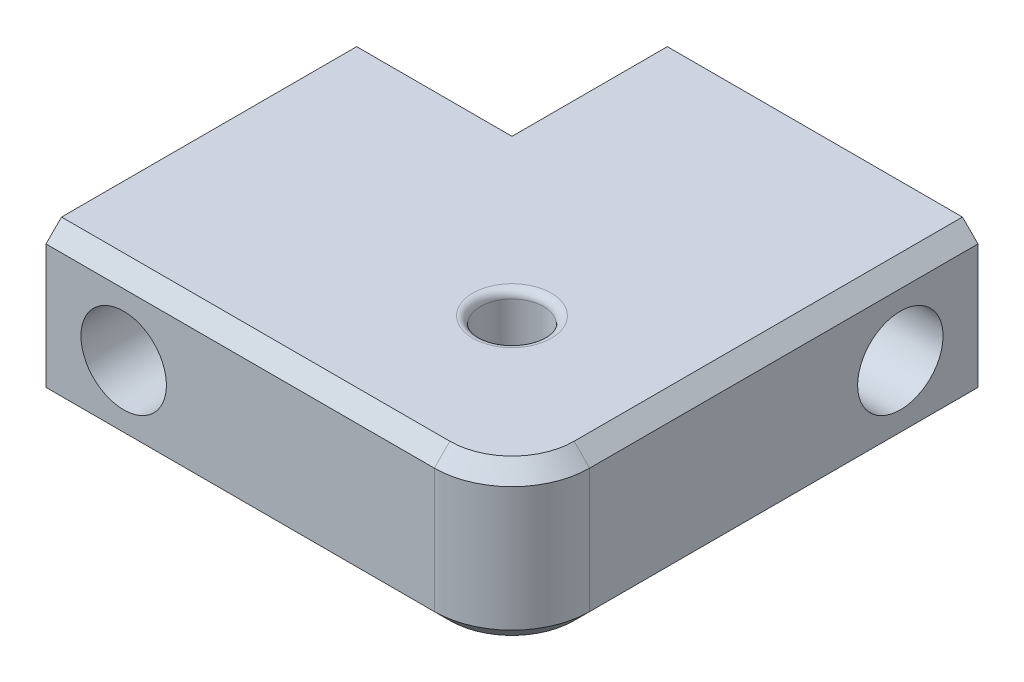
ISO-10303-21;
HEADER;
FILE_DESCRIPTION(('STEP AP214'),'2;1');
FILE_NAME('part.step','',(''),(''),'','','');
FILE_SCHEMA(('AUTOMOTIVE_DESIGN { 1 0 10303 214 1 1 1 1 }'));
ENDSEC;
DATA;
#1=APPLICATION_CONTEXT('core data for automotive mechanical design processes');
#2=APPLICATION_PROTOCOL_DEFINITION('international standard','automotive_design',2000,#1);
#3=PRODUCT_CONTEXT('',#1,'mechanical');
#4=PRODUCT('Part','Part','',(#3));
#5=PRODUCT_RELATED_PRODUCT_CATEGORY('part','',(#4));
#6=PRODUCT_DEFINITION_FORMATION('','',#4);
#7=PRODUCT_DEFINITION_CONTEXT('part definition',#1,'design');
#8=PRODUCT_DEFINITION('design','',#6,#7);
#9=PRODUCT_DEFINITION_SHAPE('','',#8);
#10=(LENGTH_UNIT() NAMED_UNIT(*) SI_UNIT(.MILLI.,.METRE.));
#11=(NAMED_UNIT(*) PLANE_ANGLE_UNIT() SI_UNIT($,.RADIAN.));
#12=(NAMED_UNIT(*) SI_UNIT($,.STERADIAN.) SOLID_ANGLE_UNIT());
#13=UNCERTAINTY_MEASURE_WITH_UNIT(LENGTH_MEASURE(1.E-05),#10,'distance_accuracy_value','');
#14=(GEOMETRIC_REPRESENTATION_CONTEXT(3) GLOBAL_UNCERTAINTY_ASSIGNED_CONTEXT((#13)) GLOBAL_UNIT_ASSIGNED_CONTEXT((#10,
#11,#12)) REPRESENTATION_CONTEXT('',''));
#15=CARTESIAN_POINT('',(0.,0.,0.));
#16=DIRECTION('',(0.,0.,1.));
#17=DIRECTION('',(1.,0.,0.));
#18=AXIS2_PLACEMENT_3D('',#15,#16,#17);
#19=CARTESIAN_POINT('',(10.,20.,10.));
#20=DIRECTION('',(0.,1.,0.));
#21=DIRECTION('',(0.,0.,1.));
#22=AXIS2_PLACEMENT_3D('',#19,#20,#21);
#23=PLANE('',#22);
#24=CARTESIAN_POINT('',(0.,20.,0.));
#25=DIRECTION('',(0.,1.,0.));
#26=DIRECTION('',(0.,0.,1.));
#27=AXIS2_PLACEMENT_3D('',#24,#25,#26);
#28=CIRCLE('',#27,5.05);
#29=CARTESIAN_POINT('',(0.,20.,5.05));
#30=VERTEX_POINT('',#29);
#31=EDGE_CURVE('E155',#30,#30,#28,.F.);
#32=ORIENTED_EDGE('',*,*,#31,.T.);
#33=EDGE_LOOP('',(#32));
#34=FACE_BOUND('',#33,.T.);
#35=CARTESIAN_POINT('',(10.,20.,10.));
#36=DIRECTION('',(0.,1.,0.));
#37=DIRECTION('',(0.,0.,1.));
#38=AXIS2_PLACEMENT_3D('',#35,#36,#37);
#39=CIRCLE('',#38,8.00000000000001);
#40=CARTESIAN_POINT('',(10.,20.,18.));
#41=VERTEX_POINT('',#40);
#42=CARTESIAN_POINT('',(18.,20.,10.));
#43=VERTEX_POINT('',#42);
#44=EDGE_CURVE('E51',#41,#43,#39,.T.);
#45=ORIENTED_EDGE('',*,*,#44,.T.);
#46=DIRECTION('',(0.,0.,-1.));
#47=VECTOR('',#46,1.);
#48=CARTESIAN_POINT('',(18.,20.,-40.));
#49=LINE('',#48,#47);
#50=CARTESIAN_POINT('',(18.,20.,-40.));
#51=VERTEX_POINT('',#50);
#52=EDGE_CURVE('E11',#43,#51,#49,.T.);
#53=ORIENTED_EDGE('',*,*,#52,.T.);
#54=DIRECTION('',(-1.,0.,0.));
#55=VECTOR('',#54,1.);
#56=CARTESIAN_POINT('',(-20.,20.,-40.));
#57=LINE('',#56,#55);
#58=CARTESIAN_POINT('',(-20.,20.,-40.));
#59=VERTEX_POINT('',#58);
#60=EDGE_CURVE('E136',#51,#59,#57,.T.);
#61=ORIENTED_EDGE('',*,*,#60,.T.);
#62=DIRECTION('',(0.,0.,1.));
#63=VECTOR('',#62,1.);
#64=CARTESIAN_POINT('',(-20.,20.,-20.));
#65=LINE('',#64,#63);
#66=CARTESIAN_POINT('',(-20.,20.,-20.));
#67=VERTEX_POINT('',#66);
#68=EDGE_CURVE('E137',#59,#67,#65,.T.);
#69=ORIENTED_EDGE('',*,*,#68,.T.);
#70=DIRECTION('',(-1.,0.,0.));
#71=VECTOR('',#70,1.);
#72=CARTESIAN_POINT('',(-20.,20.,-20.));
#73=LINE('',#72,#71);
#74=CARTESIAN_POINT('',(-40.,20.,-20.));
#75=VERTEX_POINT('',#74);
#76=EDGE_CURVE('E127',#67,#75,#73,.T.);
#77=ORIENTED_EDGE('',*,*,#76,.T.);
#78=DIRECTION('',(0.,0.,1.));
#79=VECTOR('',#78,1.);
#80=CARTESIAN_POINT('',(-40.,20.,20.));
#81=LINE('',#80,#79);
#82=CARTESIAN_POINT('',(-40.,20.,18.));
#83=VERTEX_POINT('',#82);
#84=EDGE_CURVE('E134',#75,#83,#81,.T.);
#85=ORIENTED_EDGE('',*,*,#84,.T.);
#86=DIRECTION('',(1.,0.,0.));
#87=VECTOR('',#86,1.);
#88=CARTESIAN_POINT('',(10.,20.,18.));
#89=LINE('',#88,#87);
#90=EDGE_CURVE('E65',#83,#41,#89,.T.);
#91=ORIENTED_EDGE('',*,*,#90,.T.);
#92=EDGE_LOOP('',(#45,#53,#61,#69,#77,#85,#91));
#93=FACE_BOUND('',#92,.T.);
#94=ADVANCED_FACE('F41',(#34,#93),#23,.T.);
#95=CARTESIAN_POINT('',(10.,0.,10.));
#96=DIRECTION('',(0.,1.,0.));
#97=DIRECTION('',(0.,0.,1.));
#98=AXIS2_PLACEMENT_3D('',#95,#96,#97);
#99=PLANE('',#98);
#100=DIRECTION('',(-1.,0.,0.));
#101=VECTOR('',#100,1.);
#102=CARTESIAN_POINT('',(-20.,0.,-40.));
#103=LINE('',#102,#101);
#104=CARTESIAN_POINT('',(18.,0.,-40.));
#105=VERTEX_POINT('',#104);
#106=CARTESIAN_POINT('',(-20.,0.,-40.));
#107=VERTEX_POINT('',#106);
#108=EDGE_CURVE('E144',#105,#107,#103,.T.);
#109=ORIENTED_EDGE('',*,*,#108,.F.);
#110=DIRECTION('',(0.,0.,1.));
#111=VECTOR('',#110,1.);
#112=CARTESIAN_POINT('',(18.,0.,10.));
#113=LINE('',#112,#111);
#114=CARTESIAN_POINT('',(18.,0.,10.));
#115=VERTEX_POINT('',#114);
#116=EDGE_CURVE('E173',#105,#115,#113,.T.);
#117=ORIENTED_EDGE('',*,*,#116,.T.);
#118=CARTESIAN_POINT('',(10.,0.,10.));
#119=DIRECTION('',(0.,1.,0.));
#120=DIRECTION('',(0.,0.,1.));
#121=AXIS2_PLACEMENT_3D('',#118,#119,#120);
#122=CIRCLE('',#121,7.99999999999999);
#123=CARTESIAN_POINT('',(10.,0.,18.));
#124=VERTEX_POINT('',#123);
#125=EDGE_CURVE('E171',#115,#124,#122,.F.);
#126=ORIENTED_EDGE('',*,*,#125,.T.);
#127=DIRECTION('',(-1.,0.,0.));
#128=VECTOR('',#127,1.);
#129=CARTESIAN_POINT('',(10.,0.,18.));
#130=LINE('',#129,#128);
#131=CARTESIAN_POINT('',(-40.,0.,18.));
#132=VERTEX_POINT('',#131);
#133=EDGE_CURVE('E169',#124,#132,#130,.T.);
#134=ORIENTED_EDGE('',*,*,#133,.T.);
#135=DIRECTION('',(0.,0.,1.));
#136=VECTOR('',#135,1.);
#137=CARTESIAN_POINT('',(-40.,0.,20.));
#138=LINE('',#137,#136);
#139=CARTESIAN_POINT('',(-40.,0.,-20.));
#140=VERTEX_POINT('',#139);
#141=EDGE_CURVE('E232',#140,#132,#138,.T.);
#142=ORIENTED_EDGE('',*,*,#141,.F.);
#143=DIRECTION('',(-1.,0.,0.));
#144=VECTOR('',#143,1.);
#145=CARTESIAN_POINT('',(-20.,0.,-20.));
#146=LINE('',#145,#144);
#147=CARTESIAN_POINT('',(-20.,0.,-20.));
#148=VERTEX_POINT('',#147);
#149=EDGE_CURVE('E231',#148,#140,#146,.T.);
#150=ORIENTED_EDGE('',*,*,#149,.F.);
#151=DIRECTION('',(0.,0.,1.));
#152=VECTOR('',#151,1.);
#153=CARTESIAN_POINT('',(-20.,0.,-20.));
#154=LINE('',#153,#152);
#155=EDGE_CURVE('E149',#107,#148,#154,.T.);
#156=ORIENTED_EDGE('',*,*,#155,.F.);
#157=EDGE_LOOP('',(#109,#117,#126,#134,#142,#150,#156));
#158=FACE_BOUND('',#157,.T.);
#159=CARTESIAN_POINT('',(0.,0.,0.));
#160=DIRECTION('',(0.,1.,0.));
#161=DIRECTION('',(0.,0.,1.));
#162=AXIS2_PLACEMENT_3D('',#159,#160,#161);
#163=CIRCLE('',#162,4.05);
#164=CARTESIAN_POINT('',(0.,0.,4.05));
#165=VERTEX_POINT('',#164);
#166=EDGE_CURVE('E198',#165,#165,#163,.T.);
#167=ORIENTED_EDGE('',*,*,#166,.T.);
#168=EDGE_LOOP('',(#167));
#169=FACE_BOUND('',#168,.T.);
#170=ADVANCED_FACE('F287',(#158,#169),#99,.F.);
#171=CARTESIAN_POINT('',(-20.,20.,-20.));
#172=DIRECTION('',(1.,0.,0.));
#173=DIRECTION('',(0.,0.,-1.));
#174=AXIS2_PLACEMENT_3D('',#171,#172,#173);
#175=PLANE('',#174);
#176=CARTESIAN_POINT('',(-20.,10.,-30.));
#177=DIRECTION('',(-1.,0.,0.));
#178=DIRECTION('',(0.,0.,1.));
#179=AXIS2_PLACEMENT_3D('',#176,#177,#178);
#180=CIRCLE('',#179,2.65);
#181=CARTESIAN_POINT('',(-20.,10.,-27.35));
#182=VERTEX_POINT('',#181);
#183=EDGE_CURVE('E199',#182,#182,#180,.T.);
#184=ORIENTED_EDGE('',*,*,#183,.F.);
#185=EDGE_LOOP('',(#184));
#186=FACE_BOUND('',#185,.T.);
#187=ORIENTED_EDGE('',*,*,#155,.T.);
#188=DIRECTION('',(0.,-1.,0.));
#189=VECTOR('',#188,1.);
#190=CARTESIAN_POINT('',(-20.,20.,-20.));
#191=LINE('',#190,#189);
#192=EDGE_CURVE('E128',#67,#148,#191,.T.);
#193=ORIENTED_EDGE('',*,*,#192,.F.);
#194=ORIENTED_EDGE('',*,*,#68,.F.);
#195=DIRECTION('',(0.,-1.,0.));
#196=VECTOR('',#195,1.);
#197=CARTESIAN_POINT('',(-20.,20.,-40.));
#198=LINE('',#197,#196);
#199=EDGE_CURVE('E233',#59,#107,#198,.T.);
#200=ORIENTED_EDGE('',*,*,#199,.T.);
#201=EDGE_LOOP('',(#187,#193,#194,#200));
#202=FACE_BOUND('',#201,.T.);
#203=ADVANCED_FACE('F147',(#186,#202),#175,.F.);
#204=CARTESIAN_POINT('',(-20.,20.,-20.));
#205=DIRECTION('',(0.,0.,1.));
#206=DIRECTION('',(1.,0.,0.));
#207=AXIS2_PLACEMENT_3D('',#204,#205,#206);
#208=PLANE('',#207);
#209=CARTESIAN_POINT('',(-30.,10.,-20.));
#210=DIRECTION('',(0.,0.,-1.));
#211=DIRECTION('',(-1.,0.,0.));
#212=AXIS2_PLACEMENT_3D('',#209,#210,#211);
#213=CIRCLE('',#212,2.65);
#214=CARTESIAN_POINT('',(-32.65,10.,-20.));
#215=VERTEX_POINT('',#214);
#216=EDGE_CURVE('E209',#215,#215,#213,.T.);
#217=ORIENTED_EDGE('',*,*,#216,.F.);
#218=EDGE_LOOP('',(#217));
#219=FACE_BOUND('',#218,.T.);
#220=ORIENTED_EDGE('',*,*,#149,.T.);
#221=DIRECTION('',(0.,-1.,0.));
#222=VECTOR('',#221,1.);
#223=CARTESIAN_POINT('',(-40.,20.,-20.));
#224=LINE('',#223,#222);
#225=EDGE_CURVE('E131',#75,#140,#224,.T.);
#226=ORIENTED_EDGE('',*,*,#225,.F.);
#227=ORIENTED_EDGE('',*,*,#76,.F.);
#228=ORIENTED_EDGE('',*,*,#192,.T.);
#229=EDGE_LOOP('',(#220,#226,#227,#228));
#230=FACE_BOUND('',#229,.T.);
#231=ADVANCED_FACE('F129',(#219,#230),#208,.F.);
#232=CARTESIAN_POINT('',(-40.,20.,20.));
#233=DIRECTION('',(1.,0.,0.));
#234=DIRECTION('',(0.,0.,-1.));
#235=AXIS2_PLACEMENT_3D('',#232,#233,#234);
#236=PLANE('',#235);
#237=ORIENTED_EDGE('',*,*,#141,.T.);
#238=DIRECTION('',(0.,-0.707106781186545,-0.70710678118655));
#239=VECTOR('',#238,1.);
#240=CARTESIAN_POINT('',(-40.,1.99999999999999,20.));
#241=LINE('',#240,#239);
#242=CARTESIAN_POINT('',(-40.,1.99999999999999,20.));
#243=VERTEX_POINT('',#242);
#244=EDGE_CURVE('E184',#132,#243,#241,.F.);
#245=ORIENTED_EDGE('',*,*,#244,.T.);
#246=DIRECTION('',(0.,-1.,0.));
#247=VECTOR('',#246,1.);
#248=CARTESIAN_POINT('',(-40.,20.,20.));
#249=LINE('',#248,#247);
#250=CARTESIAN_POINT('',(-40.,18.,20.));
#251=VERTEX_POINT('',#250);
#252=EDGE_CURVE('E152',#251,#243,#249,.T.);
#253=ORIENTED_EDGE('',*,*,#252,.F.);
#254=DIRECTION('',(0.,0.70710678118655,-0.707106781186545));
#255=VECTOR('',#254,1.);
#256=CARTESIAN_POINT('',(-40.,20.,18.));
#257=LINE('',#256,#255);
#258=EDGE_CURVE('E182',#251,#83,#257,.T.);
#259=ORIENTED_EDGE('',*,*,#258,.T.);
#260=ORIENTED_EDGE('',*,*,#84,.F.);
#261=ORIENTED_EDGE('',*,*,#225,.T.);
#262=EDGE_LOOP('',(#237,#245,#253,#259,#260,#261));
#263=FACE_BOUND('',#262,.T.);
#264=ADVANCED_FACE('F285',(#263),#236,.F.);
#265=CARTESIAN_POINT('',(10.,20.,20.));
#266=DIRECTION('',(0.,0.,-1.));
#267=DIRECTION('',(-1.,0.,0.));
#268=AXIS2_PLACEMENT_3D('',#265,#266,#267);
#269=PLANE('',#268);
#270=CARTESIAN_POINT('',(-30.,10.,20.));
#271=DIRECTION('',(0.,0.,-1.));
#272=DIRECTION('',(-1.,0.,0.));
#273=AXIS2_PLACEMENT_3D('',#270,#271,#272);
#274=CIRCLE('',#273,5.5);
#275=CARTESIAN_POINT('',(-35.5,10.,20.));
#276=VERTEX_POINT('',#275);
#277=EDGE_CURVE('E46',#276,#276,#274,.T.);
#278=ORIENTED_EDGE('',*,*,#277,.T.);
#279=EDGE_LOOP('',(#278));
#280=FACE_BOUND('',#279,.T.);
#281=ORIENTED_EDGE('',*,*,#252,.T.);
#282=DIRECTION('',(1.,0.,0.));
#283=VECTOR('',#282,1.);
#284=CARTESIAN_POINT('',(10.,1.99999999999999,20.));
#285=LINE('',#284,#283);
#286=CARTESIAN_POINT('',(10.,1.99999999999999,20.));
#287=VERTEX_POINT('',#286);
#288=EDGE_CURVE('E181',#243,#287,#285,.T.);
#289=ORIENTED_EDGE('',*,*,#288,.T.);
#290=DIRECTION('',(0.,-1.,0.));
#291=VECTOR('',#290,1.);
#292=CARTESIAN_POINT('',(10.,20.,20.));
#293=LINE('',#292,#291);
#294=CARTESIAN_POINT('',(10.,18.,20.));
#295=VERTEX_POINT('',#294);
#296=EDGE_CURVE('E246',#295,#287,#293,.T.);
#297=ORIENTED_EDGE('',*,*,#296,.F.);
#298=DIRECTION('',(-1.,0.,0.));
#299=VECTOR('',#298,1.);
#300=CARTESIAN_POINT('',(-40.,18.,20.));
#301=LINE('',#300,#299);
#302=EDGE_CURVE('E177',#295,#251,#301,.T.);
#303=ORIENTED_EDGE('',*,*,#302,.T.);
#304=EDGE_LOOP('',(#281,#289,#297,#303));
#305=FACE_BOUND('',#304,.T.);
#306=ADVANCED_FACE('F255',(#280,#305),#269,.F.);
#307=CARTESIAN_POINT('',(10.,20.,10.));
#308=DIRECTION('',(0.,-1.,0.));
#309=DIRECTION('',(0.,0.,-1.));
#310=AXIS2_PLACEMENT_3D('',#307,#308,#309);
#311=CYLINDRICAL_SURFACE('',#310,10.);
#312=ORIENTED_EDGE('',*,*,#296,.T.);
#313=CARTESIAN_POINT('',(10.,1.99999999999999,10.));
#314=DIRECTION('',(0.,1.,0.));
#315=DIRECTION('',(0.,0.,1.));
#316=AXIS2_PLACEMENT_3D('',#313,#314,#315);
#317=CIRCLE('',#316,10.);
#318=CARTESIAN_POINT('',(20.,1.99999999999999,10.));
#319=VERTEX_POINT('',#318);
#320=EDGE_CURVE('E180',#287,#319,#317,.T.);
#321=ORIENTED_EDGE('',*,*,#320,.T.);
#322=DIRECTION('',(0.,-1.,0.));
#323=VECTOR('',#322,1.);
#324=CARTESIAN_POINT('',(20.,20.,10.));
#325=LINE('',#324,#323);
#326=CARTESIAN_POINT('',(20.,18.,10.));
#327=VERTEX_POINT('',#326);
#328=EDGE_CURVE('E243',#327,#319,#325,.T.);
#329=ORIENTED_EDGE('',*,*,#328,.F.);
#330=CARTESIAN_POINT('',(10.,18.,10.));
#331=DIRECTION('',(0.,1.,0.));
#332=DIRECTION('',(0.,0.,1.));
#333=AXIS2_PLACEMENT_3D('',#330,#331,#332);
#334=CIRCLE('',#333,10.);
#335=EDGE_CURVE('E174',#327,#295,#334,.F.);
#336=ORIENTED_EDGE('',*,*,#335,.T.);
#337=EDGE_LOOP('',(#312,#321,#329,#336));
#338=FACE_BOUND('',#337,.T.);
#339=ADVANCED_FACE('F266',(#338),#311,.T.);
#340=CARTESIAN_POINT('',(20.,20.,-40.));
#341=DIRECTION('',(-1.,0.,0.));
#342=DIRECTION('',(0.,0.,1.));
#343=AXIS2_PLACEMENT_3D('',#340,#341,#342);
#344=PLANE('',#343);
#345=CARTESIAN_POINT('',(20.,10.,-30.));
#346=DIRECTION('',(-1.,0.,0.));
#347=DIRECTION('',(0.,0.,1.));
#348=AXIS2_PLACEMENT_3D('',#345,#346,#347);
#349=CIRCLE('',#348,5.5);
#350=CARTESIAN_POINT('',(20.,10.,-24.5));
#351=VERTEX_POINT('',#350);
#352=EDGE_CURVE('E207',#351,#351,#349,.T.);
#353=ORIENTED_EDGE('',*,*,#352,.T.);
#354=EDGE_LOOP('',(#353));
#355=FACE_BOUND('',#354,.T.);
#356=ORIENTED_EDGE('',*,*,#328,.T.);
#357=DIRECTION('',(0.,0.,-1.));
#358=VECTOR('',#357,1.);
#359=CARTESIAN_POINT('',(20.,1.99999999999999,-40.));
#360=LINE('',#359,#358);
#361=CARTESIAN_POINT('',(20.,1.99999999999999,-40.));
#362=VERTEX_POINT('',#361);
#363=EDGE_CURVE('E162',#319,#362,#360,.T.);
#364=ORIENTED_EDGE('',*,*,#363,.T.);
#365=DIRECTION('',(0.,-1.,0.));
#366=VECTOR('',#365,1.);
#367=CARTESIAN_POINT('',(20.,20.,-40.));
#368=LINE('',#367,#366);
#369=CARTESIAN_POINT('',(20.,18.,-40.));
#370=VERTEX_POINT('',#369);
#371=EDGE_CURVE('E239',#370,#362,#368,.T.);
#372=ORIENTED_EDGE('',*,*,#371,.F.);
#373=DIRECTION('',(0.,0.,1.));
#374=VECTOR('',#373,1.);
#375=CARTESIAN_POINT('',(20.,18.,10.));
#376=LINE('',#375,#374);
#377=EDGE_CURVE('E156',#370,#327,#376,.T.);
#378=ORIENTED_EDGE('',*,*,#377,.T.);
#379=EDGE_LOOP('',(#356,#364,#372,#378));
#380=FACE_BOUND('',#379,.T.);
#381=ADVANCED_FACE('F271',(#355,#380),#344,.F.);
#382=CARTESIAN_POINT('',(-20.,20.,-40.));
#383=DIRECTION('',(0.,0.,1.));
#384=DIRECTION('',(1.,0.,0.));
#385=AXIS2_PLACEMENT_3D('',#382,#383,#384);
#386=PLANE('',#385);
#387=ORIENTED_EDGE('',*,*,#371,.T.);
#388=DIRECTION('',(0.70710678118655,0.707106781186545,0.));
#389=VECTOR('',#388,1.);
#390=CARTESIAN_POINT('',(20.,1.99999999999999,-40.));
#391=LINE('',#390,#389);
#392=EDGE_CURVE('E170',#362,#105,#391,.F.);
#393=ORIENTED_EDGE('',*,*,#392,.T.);
#394=ORIENTED_EDGE('',*,*,#108,.T.);
#395=ORIENTED_EDGE('',*,*,#199,.F.);
#396=ORIENTED_EDGE('',*,*,#60,.F.);
#397=DIRECTION('',(0.707106781186545,-0.70710678118655,0.));
#398=VECTOR('',#397,1.);
#399=CARTESIAN_POINT('',(18.,20.,-40.));
#400=LINE('',#399,#398);
#401=EDGE_CURVE('E164',#51,#370,#400,.T.);
#402=ORIENTED_EDGE('',*,*,#401,.T.);
#403=EDGE_LOOP('',(#387,#393,#394,#395,#396,#402));
#404=FACE_BOUND('',#403,.T.);
#405=ADVANCED_FACE('F292',(#404),#386,.F.);
#406=CARTESIAN_POINT('',(0.,20.,0.));
#407=DIRECTION('',(0.,-1.,0.));
#408=DIRECTION('',(0.,0.,-1.));
#409=AXIS2_PLACEMENT_3D('',#406,#407,#408);
#410=CYLINDRICAL_SURFACE('',#409,4.05);
#411=CARTESIAN_POINT('',(0.,19.,0.));
#412=DIRECTION('',(0.,1.,0.));
#413=DIRECTION('',(0.,0.,1.));
#414=AXIS2_PLACEMENT_3D('',#411,#412,#413);
#415=CIRCLE('',#414,4.05);
#416=CARTESIAN_POINT('',(0.,19.,4.05));
#417=VERTEX_POINT('',#416);
#418=EDGE_CURVE('E146',#417,#417,#415,.T.);
#419=ORIENTED_EDGE('',*,*,#418,.T.);
#420=EDGE_LOOP('',(#419));
#421=FACE_BOUND('',#420,.T.);
#422=ORIENTED_EDGE('',*,*,#166,.F.);
#423=EDGE_LOOP('',(#422));
#424=FACE_BOUND('',#423,.T.);
#425=ADVANCED_FACE('F295',(#421,#424),#410,.F.);
#426=CARTESIAN_POINT('',(0.,19.,0.));
#427=DIRECTION('',(0.,1.,0.));
#428=DIRECTION('',(0.,0.,1.));
#429=AXIS2_PLACEMENT_3D('',#426,#427,#428);
#430=TOROIDAL_SURFACE('',#429,5.05,1.);
#431=ORIENTED_EDGE('',*,*,#31,.F.);
#432=EDGE_LOOP('',(#431));
#433=FACE_BOUND('',#432,.T.);
#434=ORIENTED_EDGE('',*,*,#418,.F.);
#435=EDGE_LOOP('',(#434));
#436=FACE_BOUND('',#435,.T.);
#437=ADVANCED_FACE('F301',(#433,#436),#430,.T.);
#438=CARTESIAN_POINT('',(10.,1.99999999999999,20.));
#439=DIRECTION('',(0.,0.70710678118655,-0.707106781186545));
#440=DIRECTION('',(1.,0.,0.));
#441=AXIS2_PLACEMENT_3D('',#438,#439,#440);
#442=PLANE('',#441);
#443=ORIENTED_EDGE('',*,*,#244,.F.);
#444=ORIENTED_EDGE('',*,*,#133,.F.);
#445=DIRECTION('',(0.,-0.707106781186545,-0.70710678118655));
#446=VECTOR('',#445,1.);
#447=CARTESIAN_POINT('',(10.,1.99999999999999,20.));
#448=LINE('',#447,#446);
#449=EDGE_CURVE('E195',#287,#124,#448,.T.);
#450=ORIENTED_EDGE('',*,*,#449,.F.);
#451=ORIENTED_EDGE('',*,*,#288,.F.);
#452=EDGE_LOOP('',(#443,#444,#450,#451));
#453=FACE_BOUND('',#452,.T.);
#454=ADVANCED_FACE('F258',(#453),#442,.F.);
#455=CARTESIAN_POINT('',(10.,1.99999999999999,10.));
#456=DIRECTION('',(0.,1.,0.));
#457=DIRECTION('',(0.,0.,1.));
#458=AXIS2_PLACEMENT_3D('',#455,#456,#457);
#459=CONICAL_SURFACE('',#458,10.,0.785398163397452);
#460=ORIENTED_EDGE('',*,*,#449,.T.);
#461=ORIENTED_EDGE('',*,*,#125,.F.);
#462=DIRECTION('',(-0.70710678118655,-0.707106781186545,0.));
#463=VECTOR('',#462,1.);
#464=CARTESIAN_POINT('',(20.,1.99999999999999,10.));
#465=LINE('',#464,#463);
#466=EDGE_CURVE('E186',#319,#115,#465,.T.);
#467=ORIENTED_EDGE('',*,*,#466,.F.);
#468=ORIENTED_EDGE('',*,*,#320,.F.);
#469=EDGE_LOOP('',(#460,#461,#467,#468));
#470=FACE_BOUND('',#469,.T.);
#471=ADVANCED_FACE('F267',(#470),#459,.T.);
#472=CARTESIAN_POINT('',(20.,1.99999999999999,-40.));
#473=DIRECTION('',(-0.707106781186545,0.70710678118655,0.));
#474=DIRECTION('',(0.,0.,-1.));
#475=AXIS2_PLACEMENT_3D('',#472,#473,#474);
#476=PLANE('',#475);
#477=ORIENTED_EDGE('',*,*,#466,.T.);
#478=ORIENTED_EDGE('',*,*,#116,.F.);
#479=ORIENTED_EDGE('',*,*,#392,.F.);
#480=ORIENTED_EDGE('',*,*,#363,.F.);
#481=EDGE_LOOP('',(#477,#478,#479,#480));
#482=FACE_BOUND('',#481,.T.);
#483=ADVANCED_FACE('F286',(#482),#476,.F.);
#484=CARTESIAN_POINT('',(10.,20.,18.));
#485=DIRECTION('',(0.,0.707106781186545,0.70710678118655));
#486=DIRECTION('',(-1.,0.,0.));
#487=AXIS2_PLACEMENT_3D('',#484,#485,#486);
#488=PLANE('',#487);
#489=ORIENTED_EDGE('',*,*,#258,.F.);
#490=ORIENTED_EDGE('',*,*,#302,.F.);
#491=DIRECTION('',(0.,-0.70710678118655,0.707106781186545));
#492=VECTOR('',#491,1.);
#493=CARTESIAN_POINT('',(10.,20.,18.));
#494=LINE('',#493,#492);
#495=EDGE_CURVE('E194',#41,#295,#494,.T.);
#496=ORIENTED_EDGE('',*,*,#495,.F.);
#497=ORIENTED_EDGE('',*,*,#90,.F.);
#498=EDGE_LOOP('',(#489,#490,#496,#497));
#499=FACE_BOUND('',#498,.T.);
#500=ADVANCED_FACE('F42',(#499),#488,.T.);
#501=CARTESIAN_POINT('',(10.,20.,10.));
#502=DIRECTION('',(0.,-1.,0.));
#503=DIRECTION('',(0.,0.,-1.));
#504=AXIS2_PLACEMENT_3D('',#501,#502,#503);
#505=CONICAL_SURFACE('',#504,8.00000000000001,0.785398163397445);
#506=ORIENTED_EDGE('',*,*,#495,.T.);
#507=ORIENTED_EDGE('',*,*,#335,.F.);
#508=DIRECTION('',(0.707106781186545,-0.70710678118655,0.));
#509=VECTOR('',#508,1.);
#510=CARTESIAN_POINT('',(18.,20.,10.));
#511=LINE('',#510,#509);
#512=EDGE_CURVE('E200',#43,#327,#511,.T.);
#513=ORIENTED_EDGE('',*,*,#512,.F.);
#514=ORIENTED_EDGE('',*,*,#44,.F.);
#515=EDGE_LOOP('',(#506,#507,#513,#514));
#516=FACE_BOUND('',#515,.T.);
#517=ADVANCED_FACE('F278',(#516),#505,.T.);
#518=CARTESIAN_POINT('',(18.,20.,10.));
#519=DIRECTION('',(0.70710678118655,0.707106781186545,0.));
#520=DIRECTION('',(0.,0.,1.));
#521=AXIS2_PLACEMENT_3D('',#518,#519,#520);
#522=PLANE('',#521);
#523=ORIENTED_EDGE('',*,*,#512,.T.);
#524=ORIENTED_EDGE('',*,*,#377,.F.);
#525=ORIENTED_EDGE('',*,*,#401,.F.);
#526=ORIENTED_EDGE('',*,*,#52,.F.);
#527=EDGE_LOOP('',(#523,#524,#525,#526));
#528=FACE_BOUND('',#527,.T.);
#529=ADVANCED_FACE('F280',(#528),#522,.T.);
#530=CARTESIAN_POINT('',(20.,10.,-30.));
#531=DIRECTION('',(-1.,0.,0.));
#532=DIRECTION('',(0.,0.,1.));
#533=AXIS2_PLACEMENT_3D('',#530,#531,#532);
#534=CYLINDRICAL_SURFACE('',#533,2.65);
#535=CARTESIAN_POINT('',(-8.99999999999999,10.,-30.));
#536=DIRECTION('',(-1.,0.,0.));
#537=DIRECTION('',(0.,0.,1.));
#538=AXIS2_PLACEMENT_3D('',#535,#536,#537);
#539=CIRCLE('',#538,2.65);
#540=CARTESIAN_POINT('',(-8.99999999999999,10.,-27.35));
#541=VERTEX_POINT('',#540);
#542=EDGE_CURVE('E203',#541,#541,#539,.F.);
#543=ORIENTED_EDGE('',*,*,#542,.T.);
#544=EDGE_LOOP('',(#543));
#545=FACE_BOUND('',#544,.T.);
#546=ORIENTED_EDGE('',*,*,#183,.T.);
#547=EDGE_LOOP('',(#546));
#548=FACE_BOUND('',#547,.T.);
#549=ADVANCED_FACE('F317',(#545,#548),#534,.F.);
#550=CARTESIAN_POINT('',(-30.,10.,20.));
#551=DIRECTION('',(0.,0.,-1.));
#552=DIRECTION('',(-1.,0.,0.));
#553=AXIS2_PLACEMENT_3D('',#550,#551,#552);
#554=CYLINDRICAL_SURFACE('',#553,2.65);
#555=CARTESIAN_POINT('',(-30.,10.,-9.00000000000001));
#556=DIRECTION('',(0.,0.,-1.));
#557=DIRECTION('',(-1.,0.,0.));
#558=AXIS2_PLACEMENT_3D('',#555,#556,#557);
#559=CIRCLE('',#558,2.65);
#560=CARTESIAN_POINT('',(-32.65,10.,-9.00000000000001));
#561=VERTEX_POINT('',#560);
#562=EDGE_CURVE('E208',#561,#561,#559,.F.);
#563=ORIENTED_EDGE('',*,*,#562,.T.);
#564=EDGE_LOOP('',(#563));
#565=FACE_BOUND('',#564,.T.);
#566=ORIENTED_EDGE('',*,*,#216,.T.);
#567=EDGE_LOOP('',(#566));
#568=FACE_BOUND('',#567,.T.);
#569=ADVANCED_FACE('F316',(#565,#568),#554,.F.);
#570=CARTESIAN_POINT('',(31.,10.,-30.));
#571=DIRECTION('',(-1.,0.,0.));
#572=DIRECTION('',(0.,0.,1.));
#573=AXIS2_PLACEMENT_3D('',#570,#571,#572);
#574=CYLINDRICAL_SURFACE('',#573,5.5);
#575=CARTESIAN_POINT('',(-9.,10.,-30.));
#576=DIRECTION('',(-1.,0.,0.));
#577=DIRECTION('',(0.,0.,1.));
#578=AXIS2_PLACEMENT_3D('',#575,#576,#577);
#579=CIRCLE('',#578,5.5);
#580=CARTESIAN_POINT('',(-9.,10.,-24.5));
#581=VERTEX_POINT('',#580);
#582=EDGE_CURVE('E210',#581,#581,#579,.T.);
#583=ORIENTED_EDGE('',*,*,#582,.T.);
#584=EDGE_LOOP('',(#583));
#585=FACE_BOUND('',#584,.T.);
#586=ORIENTED_EDGE('',*,*,#352,.F.);
#587=EDGE_LOOP('',(#586));
#588=FACE_BOUND('',#587,.T.);
#589=ADVANCED_FACE('F324',(#585,#588),#574,.F.);
#590=CARTESIAN_POINT('',(-9.,10.,-30.));
#591=DIRECTION('',(-1.,0.,0.));
#592=DIRECTION('',(0.,0.,1.));
#593=AXIS2_PLACEMENT_3D('',#590,#591,#592);
#594=PLANE('',#593);
#595=ORIENTED_EDGE('',*,*,#582,.F.);
#596=EDGE_LOOP('',(#595));
#597=FACE_BOUND('',#596,.T.);
#598=ORIENTED_EDGE('',*,*,#542,.F.);
#599=EDGE_LOOP('',(#598));
#600=FACE_BOUND('',#599,.T.);
#601=ADVANCED_FACE('F328',(#597,#600),#594,.F.);
#602=CARTESIAN_POINT('',(-30.,10.,31.));
#603=DIRECTION('',(0.,0.,-1.));
#604=DIRECTION('',(-1.,0.,0.));
#605=AXIS2_PLACEMENT_3D('',#602,#603,#604);
#606=CYLINDRICAL_SURFACE('',#605,5.5);
#607=CARTESIAN_POINT('',(-30.,10.,-9.00000000000001));
#608=DIRECTION('',(0.,0.,-1.));
#609=DIRECTION('',(-1.,0.,0.));
#610=AXIS2_PLACEMENT_3D('',#607,#608,#609);
#611=CIRCLE('',#610,5.5);
#612=CARTESIAN_POINT('',(-35.5,10.,-9.00000000000001));
#613=VERTEX_POINT('',#612);
#614=EDGE_CURVE('E215',#613,#613,#611,.T.);
#615=ORIENTED_EDGE('',*,*,#614,.T.);
#616=EDGE_LOOP('',(#615));
#617=FACE_BOUND('',#616,.T.);
#618=ORIENTED_EDGE('',*,*,#277,.F.);
#619=EDGE_LOOP('',(#618));
#620=FACE_BOUND('',#619,.T.);
#621=ADVANCED_FACE('F329',(#617,#620),#606,.F.);
#622=CARTESIAN_POINT('',(-30.,10.,-9.00000000000001));
#623=DIRECTION('',(0.,0.,-1.));
#624=DIRECTION('',(-1.,0.,0.));
#625=AXIS2_PLACEMENT_3D('',#622,#623,#624);
#626=PLANE('',#625);
#627=ORIENTED_EDGE('',*,*,#614,.F.);
#628=EDGE_LOOP('',(#627));
#629=FACE_BOUND('',#628,.T.);
#630=ORIENTED_EDGE('',*,*,#562,.F.);
#631=EDGE_LOOP('',(#630));
#632=FACE_BOUND('',#631,.T.);
#633=ADVANCED_FACE('F334',(#629,#632),#626,.F.);
#634=CLOSED_SHELL('',(#94,#170,#203,#231,#264,#306,#339,#381,#405,#425,#437,#454,#471,#483,#500,
#517,#529,#549,#569,#589,#601,#621,#633));
#635=MANIFOLD_SOLID_BREP('B2',#634);
#636=ADVANCED_BREP_SHAPE_REPRESENTATION('',(#18,#635),#14);
#637=SHAPE_DEFINITION_REPRESENTATION(#9,#636);
ENDSEC;
END-ISO-10303-21;
